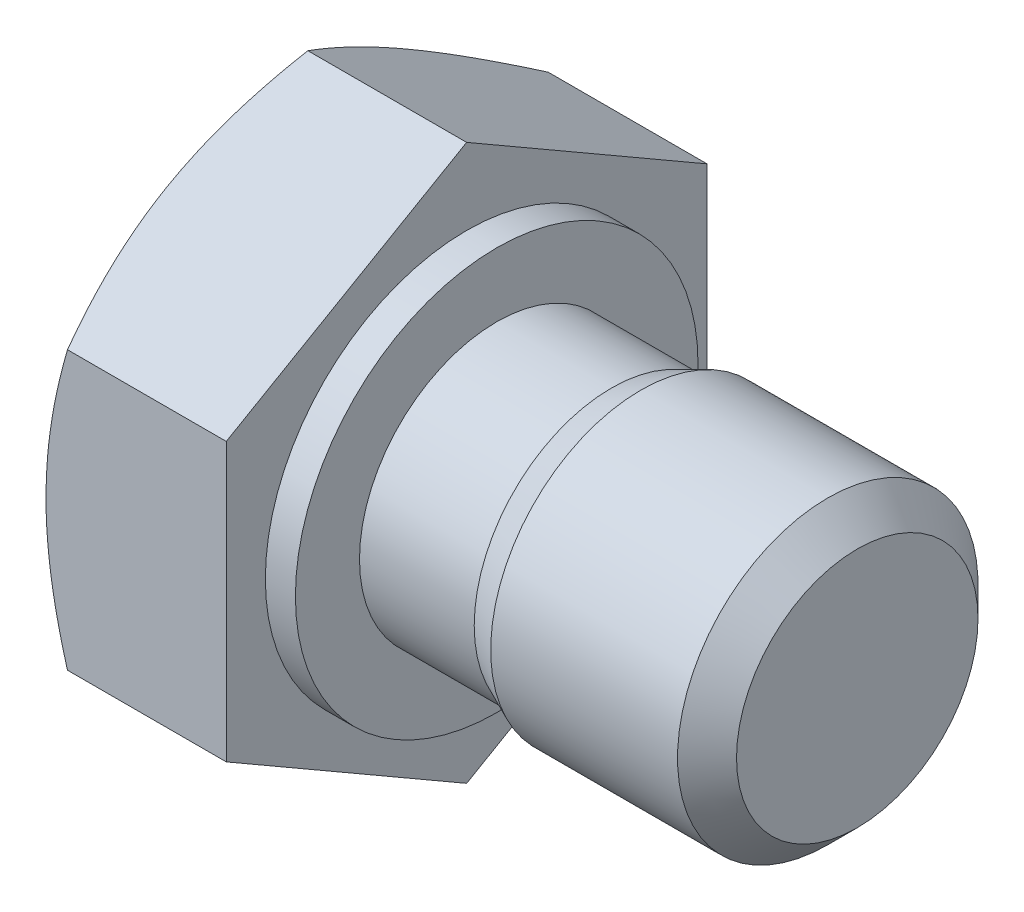
ISO-10303-21;
HEADER;
FILE_DESCRIPTION(('STEP AP214'),'2;1');
FILE_NAME('part.step','',(''),(''),'','','');
FILE_SCHEMA(('AUTOMOTIVE_DESIGN { 1 0 10303 214 1 1 1 1 }'));
ENDSEC;
DATA;
#1=APPLICATION_CONTEXT('core data for automotive mechanical design processes');
#2=APPLICATION_PROTOCOL_DEFINITION('international standard','automotive_design',2000,#1);
#3=PRODUCT_CONTEXT('',#1,'mechanical');
#4=PRODUCT('Part','Part','',(#3));
#5=PRODUCT_RELATED_PRODUCT_CATEGORY('part','',(#4));
#6=PRODUCT_DEFINITION_FORMATION('','',#4);
#7=PRODUCT_DEFINITION_CONTEXT('part definition',#1,'design');
#8=PRODUCT_DEFINITION('design','',#6,#7);
#9=PRODUCT_DEFINITION_SHAPE('','',#8);
#10=(LENGTH_UNIT() NAMED_UNIT(*) SI_UNIT(.MILLI.,.METRE.));
#11=(NAMED_UNIT(*) PLANE_ANGLE_UNIT() SI_UNIT($,.RADIAN.));
#12=(NAMED_UNIT(*) SI_UNIT($,.STERADIAN.) SOLID_ANGLE_UNIT());
#13=UNCERTAINTY_MEASURE_WITH_UNIT(LENGTH_MEASURE(1.E-05),#10,'distance_accuracy_value','');
#14=(GEOMETRIC_REPRESENTATION_CONTEXT(3) GLOBAL_UNCERTAINTY_ASSIGNED_CONTEXT((#13)) GLOBAL_UNIT_ASSIGNED_CONTEXT((#10,
#11,#12)) REPRESENTATION_CONTEXT('',''));
#15=CARTESIAN_POINT('',(0.,0.,0.));
#16=DIRECTION('',(0.,0.,1.));
#17=DIRECTION('',(1.,0.,0.));
#18=AXIS2_PLACEMENT_3D('',#15,#16,#17);
#19=CARTESIAN_POINT('',(2.15457,0.,0.));
#20=DIRECTION('',(1.,0.,0.));
#21=DIRECTION('',(0.,1.,0.));
#22=AXIS2_PLACEMENT_3D('',#19,#20,#21);
#23=CONICAL_SURFACE('',#22,2.3917468,0.415407709431619);
#24=CARTESIAN_POINT('',(2.4,0.,0.));
#25=DIRECTION('',(1.,0.,0.));
#26=DIRECTION('',(0.,1.,0.));
#27=AXIS2_PLACEMENT_3D('',#24,#25,#26);
#28=CIRCLE('',#27,2.5);
#29=CARTESIAN_POINT('',(2.4,-2.5,0.));
#30=VERTEX_POINT('',#29);
#31=EDGE_CURVE('E227',#30,#30,#28,.T.);
#32=ORIENTED_EDGE('',*,*,#31,.F.);
#33=DIRECTION('',(-0.914951860103324,0.403562998419662,0.));
#34=VECTOR('',#33,1.);
#35=CARTESIAN_POINT('',(2.15457,-2.3917468,0.));
#36=LINE('',#35,#34);
#37=CARTESIAN_POINT('',(1.90914,-2.2834936,0.));
#38=VERTEX_POINT('',#37);
#39=EDGE_CURVE('E11',#30,#38,#36,.T.);
#40=ORIENTED_EDGE('',*,*,#39,.T.);
#41=CARTESIAN_POINT('',(1.90914,0.,0.));
#42=DIRECTION('',(1.,0.,0.));
#43=DIRECTION('',(0.,1.,0.));
#44=AXIS2_PLACEMENT_3D('',#41,#42,#43);
#45=CIRCLE('',#44,2.2834936);
#46=EDGE_CURVE('E189',#38,#38,#45,.T.);
#47=ORIENTED_EDGE('',*,*,#46,.T.);
#48=ORIENTED_EDGE('',*,*,#39,.F.);
#49=EDGE_LOOP('',(#32,#40,#47,#48));
#50=FACE_BOUND('',#49,.T.);
#51=ADVANCED_FACE('F17',(#50),#23,.T.);
#52=CARTESIAN_POINT('',(0.95457,0.,0.));
#53=DIRECTION('',(1.,0.,0.));
#54=DIRECTION('',(0.,1.,0.));
#55=AXIS2_PLACEMENT_3D('',#52,#53,#54);
#56=CYLINDRICAL_SURFACE('',#55,2.2834936);
#57=ORIENTED_EDGE('',*,*,#46,.F.);
#58=DIRECTION('',(-1.,0.,0.));
#59=VECTOR('',#58,1.);
#60=CARTESIAN_POINT('',(0.95457,-2.2834936,0.));
#61=LINE('',#60,#59);
#62=CARTESIAN_POINT('',(0.,-2.2834936,0.));
#63=VERTEX_POINT('',#62);
#64=EDGE_CURVE('E28',#38,#63,#61,.T.);
#65=ORIENTED_EDGE('',*,*,#64,.T.);
#66=CARTESIAN_POINT('',(0.,0.,0.));
#67=DIRECTION('',(1.,0.,0.));
#68=DIRECTION('',(0.,1.,0.));
#69=AXIS2_PLACEMENT_3D('',#66,#67,#68);
#70=CIRCLE('',#69,2.2834936);
#71=EDGE_CURVE('E191',#63,#63,#70,.T.);
#72=ORIENTED_EDGE('',*,*,#71,.T.);
#73=ORIENTED_EDGE('',*,*,#64,.F.);
#74=EDGE_LOOP('',(#57,#65,#72,#73));
#75=FACE_BOUND('',#74,.T.);
#76=ADVANCED_FACE('F543',(#75),#56,.T.);
#77=CARTESIAN_POINT('',(0.,2.8167468,0.));
#78=DIRECTION('',(1.,0.,0.));
#79=DIRECTION('',(0.,1.,0.));
#80=AXIS2_PLACEMENT_3D('',#77,#78,#79);
#81=PLANE('',#80);
#82=ORIENTED_EDGE('',*,*,#71,.F.);
#83=EDGE_LOOP('',(#82));
#84=FACE_BOUND('',#83,.T.);
#85=CARTESIAN_POINT('',(0.,0.,0.));
#86=DIRECTION('',(1.,0.,0.));
#87=DIRECTION('',(0.,1.,0.));
#88=AXIS2_PLACEMENT_3D('',#85,#86,#87);
#89=CIRCLE('',#88,3.35);
#90=CARTESIAN_POINT('',(0.,-3.35,0.));
#91=VERTEX_POINT('',#90);
#92=EDGE_CURVE('E206',#91,#91,#89,.T.);
#93=ORIENTED_EDGE('',*,*,#92,.T.);
#94=EDGE_LOOP('',(#93));
#95=FACE_BOUND('',#94,.T.);
#96=ADVANCED_FACE('F549',(#84,#95),#81,.T.);
#97=CARTESIAN_POINT('',(-0.250049999999993,0.,0.));
#98=DIRECTION('',(1.,0.,0.));
#99=DIRECTION('',(0.,1.,0.));
#100=AXIS2_PLACEMENT_3D('',#97,#98,#99);
#101=CYLINDRICAL_SURFACE('',#100,3.35);
#102=ORIENTED_EDGE('',*,*,#92,.F.);
#103=DIRECTION('',(-1.,0.,0.));
#104=VECTOR('',#103,1.);
#105=CARTESIAN_POINT('',(-0.250049999999993,-3.35,0.));
#106=LINE('',#105,#104);
#107=CARTESIAN_POINT('',(-0.500099999999994,-3.35,0.));
#108=VERTEX_POINT('',#107);
#109=EDGE_CURVE('E199',#91,#108,#106,.T.);
#110=ORIENTED_EDGE('',*,*,#109,.T.);
#111=CARTESIAN_POINT('',(-0.500099999999993,0.,0.));
#112=DIRECTION('',(1.,0.,0.));
#113=DIRECTION('',(0.,1.,0.));
#114=AXIS2_PLACEMENT_3D('',#111,#112,#113);
#115=CIRCLE('',#114,3.35);
#116=EDGE_CURVE('E230',#108,#108,#115,.T.);
#117=ORIENTED_EDGE('',*,*,#116,.T.);
#118=ORIENTED_EDGE('',*,*,#109,.F.);
#119=EDGE_LOOP('',(#102,#110,#117,#118));
#120=FACE_BOUND('',#119,.T.);
#121=ADVANCED_FACE('F626',(#120),#101,.T.);
#122=CARTESIAN_POINT('',(-3.5001,0.,0.));
#123=DIRECTION('',(1.,0.,0.));
#124=DIRECTION('',(0.,1.,0.));
#125=AXIS2_PLACEMENT_3D('',#122,#123,#124);
#126=PLANE('',#125);
#127=CARTESIAN_POINT('',(-3.5001,0.,0.));
#128=DIRECTION('',(-1.,0.,0.));
#129=DIRECTION('',(0.,1.,0.));
#130=AXIS2_PLACEMENT_3D('',#127,#128,#129);
#131=CIRCLE('',#130,4.);
#132=CARTESIAN_POINT('',(-3.5001,0.,4.));
#133=VERTEX_POINT('',#132);
#134=CARTESIAN_POINT('',(-3.5001,3.46410161513775,2.));
#135=VERTEX_POINT('',#134);
#136=EDGE_CURVE('E210',#133,#135,#131,.T.);
#137=ORIENTED_EDGE('',*,*,#136,.T.);
#138=CARTESIAN_POINT('',(-3.5001,0.,0.));
#139=DIRECTION('',(-1.,0.,0.));
#140=DIRECTION('',(0.,1.,0.));
#141=AXIS2_PLACEMENT_3D('',#138,#139,#140);
#142=CIRCLE('',#141,4.);
#143=CARTESIAN_POINT('',(-3.5001,3.46410161513775,-2.));
#144=VERTEX_POINT('',#143);
#145=EDGE_CURVE('E159',#135,#144,#142,.T.);
#146=ORIENTED_EDGE('',*,*,#145,.T.);
#147=CARTESIAN_POINT('',(-3.5001,0.,0.));
#148=DIRECTION('',(-1.,0.,0.));
#149=DIRECTION('',(0.,1.,0.));
#150=AXIS2_PLACEMENT_3D('',#147,#148,#149);
#151=CIRCLE('',#150,4.);
#152=CARTESIAN_POINT('',(-3.5001,0.,-4.));
#153=VERTEX_POINT('',#152);
#154=EDGE_CURVE('E155',#144,#153,#151,.T.);
#155=ORIENTED_EDGE('',*,*,#154,.T.);
#156=CARTESIAN_POINT('',(-3.5001,0.,0.));
#157=DIRECTION('',(-1.,0.,0.));
#158=DIRECTION('',(0.,1.,0.));
#159=AXIS2_PLACEMENT_3D('',#156,#157,#158);
#160=CIRCLE('',#159,4.);
#161=CARTESIAN_POINT('',(-3.5001,-3.46410161513775,-2.));
#162=VERTEX_POINT('',#161);
#163=EDGE_CURVE('E129',#153,#162,#160,.T.);
#164=ORIENTED_EDGE('',*,*,#163,.T.);
#165=CARTESIAN_POINT('',(-3.5001,0.,0.));
#166=DIRECTION('',(-1.,0.,0.));
#167=DIRECTION('',(0.,1.,0.));
#168=AXIS2_PLACEMENT_3D('',#165,#166,#167);
#169=CIRCLE('',#168,4.);
#170=CARTESIAN_POINT('',(-3.5001,-3.46410161513775,2.));
#171=VERTEX_POINT('',#170);
#172=EDGE_CURVE('E167',#162,#171,#169,.T.);
#173=ORIENTED_EDGE('',*,*,#172,.T.);
#174=CARTESIAN_POINT('',(-3.5001,0.,0.));
#175=DIRECTION('',(-1.,0.,0.));
#176=DIRECTION('',(0.,1.,0.));
#177=AXIS2_PLACEMENT_3D('',#174,#175,#176);
#178=CIRCLE('',#177,4.);
#179=EDGE_CURVE('E218',#171,#133,#178,.T.);
#180=ORIENTED_EDGE('',*,*,#179,.T.);
#181=EDGE_LOOP('',(#137,#146,#155,#164,#173,#180));
#182=FACE_BOUND('',#181,.T.);
#183=ADVANCED_FACE('F157',(#182),#126,.F.);
#184=CARTESIAN_POINT('',(-0.500099999999993,-4.618802153517,0.));
#185=DIRECTION('',(0.,-0.866025403784439,-0.5));
#186=DIRECTION('',(0.,0.5,-0.866025403784439));
#187=AXIS2_PLACEMENT_3D('',#184,#185,#186);
#188=PLANE('',#187);
#189=CARTESIAN_POINT('',(-3.5001,-3.46410161513775,-2.));
#190=CARTESIAN_POINT('',(-3.50010000000001,-2.92820323027551,-2.9282032302755));
#191=CARTESIAN_POINT('',(-3.14283441009186,-2.30940107675851,-4.));
#192=(BOUNDED_CURVE() B_SPLINE_CURVE(2,(#189,#190,#191),.UNSPECIFIED.,.F.,
.F.) B_SPLINE_CURVE_WITH_KNOTS((3,3),(0.234283887510094,0.468567775020188),
.UNSPECIFIED.) CURVE() GEOMETRIC_REPRESENTATION_ITEM() RATIONAL_B_SPLINE_CURVE((1.,
1.03795484930204,1.)) REPRESENTATION_ITEM(''));
#193=CARTESIAN_POINT('',(-3.14283441009186,-2.30940107675851,-4.));
#194=VERTEX_POINT('',#193);
#195=EDGE_CURVE('E134',#162,#194,#192,.T.);
#196=ORIENTED_EDGE('',*,*,#195,.T.);
#197=DIRECTION('',(-1.,0.,0.));
#198=VECTOR('',#197,1.);
#199=CARTESIAN_POINT('',(-0.500099999999993,-2.3094010767585,-4.));
#200=LINE('',#199,#198);
#201=CARTESIAN_POINT('',(-0.500099999999993,-2.3094010767585,-4.));
#202=VERTEX_POINT('',#201);
#203=EDGE_CURVE('E21',#202,#194,#200,.T.);
#204=ORIENTED_EDGE('',*,*,#203,.F.);
#205=DIRECTION('',(0.,0.5,-0.866025403784439));
#206=VECTOR('',#205,1.);
#207=CARTESIAN_POINT('',(-0.500099999999993,-4.618802153517,0.));
#208=LINE('',#207,#206);
#209=CARTESIAN_POINT('',(-0.500099999999993,-4.618802153517,0.));
#210=VERTEX_POINT('',#209);
#211=EDGE_CURVE('E187',#210,#202,#208,.T.);
#212=ORIENTED_EDGE('',*,*,#211,.F.);
#213=DIRECTION('',(-1.,0.,0.));
#214=VECTOR('',#213,1.);
#215=CARTESIAN_POINT('',(-0.500099999999993,-4.618802153517,0.));
#216=LINE('',#215,#214);
#217=CARTESIAN_POINT('',(-3.14283441009186,-4.61880215351699,0.));
#218=VERTEX_POINT('',#217);
#219=EDGE_CURVE('E237',#210,#218,#216,.T.);
#220=ORIENTED_EDGE('',*,*,#219,.T.);
#221=CARTESIAN_POINT('',(-3.14283441009186,-4.61880215351699,0.));
#222=CARTESIAN_POINT('',(-3.50010000000001,-3.99999999999999,-1.07179676972451));
#223=CARTESIAN_POINT('',(-3.5001,-3.46410161513775,-2.));
#224=(BOUNDED_CURVE() B_SPLINE_CURVE(2,(#221,#222,#223),.UNSPECIFIED.,.F.,
.F.) B_SPLINE_CURVE_WITH_KNOTS((3,3),(0.,0.234283887510094),
.UNSPECIFIED.) CURVE() GEOMETRIC_REPRESENTATION_ITEM() RATIONAL_B_SPLINE_CURVE((1.,
1.03795484930204,1.)) REPRESENTATION_ITEM(''));
#225=EDGE_CURVE('E301',#218,#162,#224,.T.);
#226=ORIENTED_EDGE('',*,*,#225,.T.);
#227=EDGE_LOOP('',(#196,#204,#212,#220,#226));
#228=FACE_BOUND('',#227,.T.);
#229=ADVANCED_FACE('F520',(#228),#188,.T.);
#230=CARTESIAN_POINT('',(-0.500099999999993,-2.3094010767585,4.));
#231=DIRECTION('',(0.,-0.866025403784439,0.5));
#232=DIRECTION('',(-1.,0.,0.));
#233=AXIS2_PLACEMENT_3D('',#230,#231,#232);
#234=PLANE('',#233);
#235=CARTESIAN_POINT('',(-3.5001,-3.46410161513775,2.));
#236=CARTESIAN_POINT('',(-3.50010000000001,-3.99999999999999,1.0717967697245));
#237=CARTESIAN_POINT('',(-3.14283441009186,-4.61880215351699,0.));
#238=(BOUNDED_CURVE() B_SPLINE_CURVE(2,(#235,#236,#237),.UNSPECIFIED.,.F.,
.F.) B_SPLINE_CURVE_WITH_KNOTS((3,3),(0.234283887510094,0.468567775020188),
.UNSPECIFIED.) CURVE() GEOMETRIC_REPRESENTATION_ITEM() RATIONAL_B_SPLINE_CURVE((1.,
1.03795484930205,1.)) REPRESENTATION_ITEM(''));
#239=EDGE_CURVE('E173',#171,#218,#238,.T.);
#240=ORIENTED_EDGE('',*,*,#239,.T.);
#241=ORIENTED_EDGE('',*,*,#219,.F.);
#242=DIRECTION('',(0.,-0.5,-0.866025403784439));
#243=VECTOR('',#242,1.);
#244=CARTESIAN_POINT('',(-0.500099999999993,-2.3094010767585,4.));
#245=LINE('',#244,#243);
#246=CARTESIAN_POINT('',(-0.500099999999993,-2.3094010767585,4.));
#247=VERTEX_POINT('',#246);
#248=EDGE_CURVE('E180',#247,#210,#245,.T.);
#249=ORIENTED_EDGE('',*,*,#248,.F.);
#250=DIRECTION('',(-1.,0.,0.));
#251=VECTOR('',#250,1.);
#252=CARTESIAN_POINT('',(-0.500099999999993,-2.3094010767585,4.));
#253=LINE('',#252,#251);
#254=CARTESIAN_POINT('',(-3.14283441009186,-2.30940107675848,4.));
#255=VERTEX_POINT('',#254);
#256=EDGE_CURVE('E235',#247,#255,#253,.T.);
#257=ORIENTED_EDGE('',*,*,#256,.T.);
#258=CARTESIAN_POINT('',(-3.14283441009186,-2.30940107675852,4.));
#259=CARTESIAN_POINT('',(-3.50010000000001,-2.92820323027551,2.9282032302755));
#260=CARTESIAN_POINT('',(-3.5001,-3.46410161513775,2.));
#261=(BOUNDED_CURVE() B_SPLINE_CURVE(2,(#258,#259,#260),.UNSPECIFIED.,.F.,
.F.) B_SPLINE_CURVE_WITH_KNOTS((3,3),(0.,0.234283887510094),
.UNSPECIFIED.) CURVE() GEOMETRIC_REPRESENTATION_ITEM() RATIONAL_B_SPLINE_CURVE((1.,
1.03795484930203,1.)) REPRESENTATION_ITEM(''));
#262=EDGE_CURVE('E219',#255,#171,#261,.T.);
#263=ORIENTED_EDGE('',*,*,#262,.T.);
#264=EDGE_LOOP('',(#240,#241,#249,#257,#263));
#265=FACE_BOUND('',#264,.T.);
#266=ADVANCED_FACE('F528',(#265),#234,.T.);
#267=CARTESIAN_POINT('',(-0.500099999999994,2.3094010767585,4.));
#268=DIRECTION('',(0.,0.,1.));
#269=DIRECTION('',(0.,-1.,0.));
#270=AXIS2_PLACEMENT_3D('',#267,#268,#269);
#271=PLANE('',#270);
#272=CARTESIAN_POINT('',(-3.5001,0.,4.));
#273=CARTESIAN_POINT('',(-3.50010000000001,-1.07179676972448,4.));
#274=CARTESIAN_POINT('',(-3.14283441009186,-2.30940107675848,4.));
#275=(BOUNDED_CURVE() B_SPLINE_CURVE(2,(#272,#273,#274),.UNSPECIFIED.,.F.,
.F.) B_SPLINE_CURVE_WITH_KNOTS((3,3),(0.234283887510094,0.468567775020188),
.UNSPECIFIED.) CURVE() GEOMETRIC_REPRESENTATION_ITEM() RATIONAL_B_SPLINE_CURVE((1.,
1.03795484930205,1.)) REPRESENTATION_ITEM(''));
#276=EDGE_CURVE('E212',#133,#255,#275,.T.);
#277=ORIENTED_EDGE('',*,*,#276,.T.);
#278=ORIENTED_EDGE('',*,*,#256,.F.);
#279=DIRECTION('',(0.,-1.,0.));
#280=VECTOR('',#279,1.);
#281=CARTESIAN_POINT('',(-0.500099999999994,2.3094010767585,4.));
#282=LINE('',#281,#280);
#283=CARTESIAN_POINT('',(-0.500099999999994,2.3094010767585,4.));
#284=VERTEX_POINT('',#283);
#285=EDGE_CURVE('E188',#284,#247,#282,.T.);
#286=ORIENTED_EDGE('',*,*,#285,.F.);
#287=DIRECTION('',(-1.,0.,0.));
#288=VECTOR('',#287,1.);
#289=CARTESIAN_POINT('',(-0.500099999999994,2.3094010767585,4.));
#290=LINE('',#289,#288);
#291=CARTESIAN_POINT('',(-3.14283441009186,2.30940107675847,4.));
#292=VERTEX_POINT('',#291);
#293=EDGE_CURVE('E254',#284,#292,#290,.T.);
#294=ORIENTED_EDGE('',*,*,#293,.T.);
#295=CARTESIAN_POINT('',(-3.14283441009186,2.30940107675847,4.));
#296=CARTESIAN_POINT('',(-3.50010000000001,1.07179676972448,4.));
#297=CARTESIAN_POINT('',(-3.5001,0.,4.));
#298=(BOUNDED_CURVE() B_SPLINE_CURVE(2,(#295,#296,#297),.UNSPECIFIED.,.F.,
.F.) B_SPLINE_CURVE_WITH_KNOTS((3,3),(0.,0.234283887510094),
.UNSPECIFIED.) CURVE() GEOMETRIC_REPRESENTATION_ITEM() RATIONAL_B_SPLINE_CURVE((1.,
1.03795484930205,1.)) REPRESENTATION_ITEM(''));
#299=EDGE_CURVE('E262',#292,#133,#298,.T.);
#300=ORIENTED_EDGE('',*,*,#299,.T.);
#301=EDGE_LOOP('',(#277,#278,#286,#294,#300));
#302=FACE_BOUND('',#301,.T.);
#303=ADVANCED_FACE('F367',(#302),#271,.T.);
#304=CARTESIAN_POINT('',(-0.500099999999993,0.,0.));
#305=DIRECTION('',(1.,0.,0.));
#306=DIRECTION('',(0.,1.,0.));
#307=AXIS2_PLACEMENT_3D('',#304,#305,#306);
#308=PLANE('',#307);
#309=ORIENTED_EDGE('',*,*,#116,.F.);
#310=EDGE_LOOP('',(#309));
#311=FACE_BOUND('',#310,.T.);
#312=DIRECTION('',(0.,-0.5,0.866025403784438));
#313=VECTOR('',#312,1.);
#314=CARTESIAN_POINT('',(-0.500099999999994,4.618802153517,0.));
#315=LINE('',#314,#313);
#316=CARTESIAN_POINT('',(-0.500099999999994,4.618802153517,0.));
#317=VERTEX_POINT('',#316);
#318=EDGE_CURVE('E281',#317,#284,#315,.T.);
#319=ORIENTED_EDGE('',*,*,#318,.T.);
#320=ORIENTED_EDGE('',*,*,#285,.T.);
#321=ORIENTED_EDGE('',*,*,#248,.T.);
#322=ORIENTED_EDGE('',*,*,#211,.T.);
#323=DIRECTION('',(0.,1.,0.));
#324=VECTOR('',#323,1.);
#325=CARTESIAN_POINT('',(-0.500099999999993,-2.3094010767585,-4.));
#326=LINE('',#325,#324);
#327=CARTESIAN_POINT('',(-0.500099999999994,2.3094010767585,-4.));
#328=VERTEX_POINT('',#327);
#329=EDGE_CURVE('E280',#202,#328,#326,.T.);
#330=ORIENTED_EDGE('',*,*,#329,.T.);
#331=DIRECTION('',(0.,0.5,0.866025403784439));
#332=VECTOR('',#331,1.);
#333=CARTESIAN_POINT('',(-0.500099999999994,2.3094010767585,-4.));
#334=LINE('',#333,#332);
#335=EDGE_CURVE('E356',#328,#317,#334,.T.);
#336=ORIENTED_EDGE('',*,*,#335,.T.);
#337=EDGE_LOOP('',(#319,#320,#321,#322,#330,#336));
#338=FACE_BOUND('',#337,.T.);
#339=ADVANCED_FACE('F537',(#311,#338),#308,.T.);
#340=CARTESIAN_POINT('',(-0.500099999999994,4.618802153517,0.));
#341=DIRECTION('',(0.,0.866025403784438,0.5));
#342=DIRECTION('',(1.,0.,0.));
#343=AXIS2_PLACEMENT_3D('',#340,#341,#342);
#344=PLANE('',#343);
#345=CARTESIAN_POINT('',(-3.14283441009186,4.61880215351699,0.));
#346=CARTESIAN_POINT('',(-3.50010000000001,3.99999999999999,1.0717967697245));
#347=CARTESIAN_POINT('',(-3.5001,3.46410161513775,2.));
#348=(BOUNDED_CURVE() B_SPLINE_CURVE(2,(#345,#346,#347),.UNSPECIFIED.,.F.,
.F.) B_SPLINE_CURVE_WITH_KNOTS((3,3),(0.,0.234283887510094),
.UNSPECIFIED.) CURVE() GEOMETRIC_REPRESENTATION_ITEM() RATIONAL_B_SPLINE_CURVE((1.,
1.03795484930203,1.)) REPRESENTATION_ITEM(''));
#349=CARTESIAN_POINT('',(-3.14283441009186,4.61880215351699,0.));
#350=VERTEX_POINT('',#349);
#351=EDGE_CURVE('E296',#350,#135,#348,.T.);
#352=ORIENTED_EDGE('',*,*,#351,.T.);
#353=CARTESIAN_POINT('',(-3.5001,3.46410161513775,2.));
#354=CARTESIAN_POINT('',(-3.50010000000001,2.92820323027551,2.9282032302755));
#355=CARTESIAN_POINT('',(-3.14283441009186,2.30940107675851,4.));
#356=(BOUNDED_CURVE() B_SPLINE_CURVE(2,(#353,#354,#355),.UNSPECIFIED.,.F.,
.F.) B_SPLINE_CURVE_WITH_KNOTS((3,3),(0.234283887510094,0.468567775020188),
.UNSPECIFIED.) CURVE() GEOMETRIC_REPRESENTATION_ITEM() RATIONAL_B_SPLINE_CURVE((1.,
1.03795484930203,1.)) REPRESENTATION_ITEM(''));
#357=EDGE_CURVE('E270',#135,#292,#356,.T.);
#358=ORIENTED_EDGE('',*,*,#357,.T.);
#359=ORIENTED_EDGE('',*,*,#293,.F.);
#360=ORIENTED_EDGE('',*,*,#318,.F.);
#361=DIRECTION('',(-1.,0.,0.));
#362=VECTOR('',#361,1.);
#363=CARTESIAN_POINT('',(-0.500099999999994,4.618802153517,0.));
#364=LINE('',#363,#362);
#365=EDGE_CURVE('E354',#317,#350,#364,.T.);
#366=ORIENTED_EDGE('',*,*,#365,.T.);
#367=EDGE_LOOP('',(#352,#358,#359,#360,#366));
#368=FACE_BOUND('',#367,.T.);
#369=ADVANCED_FACE('F19',(#368),#344,.T.);
#370=CARTESIAN_POINT('',(-0.500099999999994,2.3094010767585,-4.));
#371=DIRECTION('',(0.,0.866025403784439,-0.5));
#372=DIRECTION('',(-1.,0.,0.));
#373=AXIS2_PLACEMENT_3D('',#370,#371,#372);
#374=PLANE('',#373);
#375=CARTESIAN_POINT('',(-3.14283441009186,2.30940107675851,-4.));
#376=CARTESIAN_POINT('',(-3.50010000000001,2.92820323027551,-2.92820323027549));
#377=CARTESIAN_POINT('',(-3.5001,3.46410161513775,-2.));
#378=(BOUNDED_CURVE() B_SPLINE_CURVE(2,(#375,#376,#377),.UNSPECIFIED.,.F.,
.F.) B_SPLINE_CURVE_WITH_KNOTS((3,3),(0.,0.234283887510095),
.UNSPECIFIED.) CURVE() GEOMETRIC_REPRESENTATION_ITEM() RATIONAL_B_SPLINE_CURVE((1.,
1.03795484930206,1.)) REPRESENTATION_ITEM(''));
#379=CARTESIAN_POINT('',(-3.14283441009186,2.30940107675848,-4.));
#380=VERTEX_POINT('',#379);
#381=EDGE_CURVE('E151',#380,#144,#378,.T.);
#382=ORIENTED_EDGE('',*,*,#381,.T.);
#383=CARTESIAN_POINT('',(-3.5001,3.46410161513775,-2.));
#384=CARTESIAN_POINT('',(-3.50010000000001,3.99999999999999,-1.0717967697245));
#385=CARTESIAN_POINT('',(-3.14283441009186,4.61880215351699,0.));
#386=(BOUNDED_CURVE() B_SPLINE_CURVE(2,(#383,#384,#385),.UNSPECIFIED.,.F.,
.F.) B_SPLINE_CURVE_WITH_KNOTS((3,3),(0.234283887510095,0.468567775020189),
.UNSPECIFIED.) CURVE() GEOMETRIC_REPRESENTATION_ITEM() RATIONAL_B_SPLINE_CURVE((1.,
1.03795484930204,1.)) REPRESENTATION_ITEM(''));
#387=EDGE_CURVE('E295',#144,#350,#386,.T.);
#388=ORIENTED_EDGE('',*,*,#387,.T.);
#389=ORIENTED_EDGE('',*,*,#365,.F.);
#390=ORIENTED_EDGE('',*,*,#335,.F.);
#391=DIRECTION('',(-1.,0.,0.));
#392=VECTOR('',#391,1.);
#393=CARTESIAN_POINT('',(-0.500099999999994,2.3094010767585,-4.));
#394=LINE('',#393,#392);
#395=EDGE_CURVE('E139',#328,#380,#394,.T.);
#396=ORIENTED_EDGE('',*,*,#395,.T.);
#397=EDGE_LOOP('',(#382,#388,#389,#390,#396));
#398=FACE_BOUND('',#397,.T.);
#399=ADVANCED_FACE('F558',(#398),#374,.T.);
#400=CARTESIAN_POINT('',(-0.500099999999993,-2.3094010767585,-4.));
#401=DIRECTION('',(0.,0.,-1.));
#402=DIRECTION('',(-1.,0.,0.));
#403=AXIS2_PLACEMENT_3D('',#400,#401,#402);
#404=PLANE('',#403);
#405=CARTESIAN_POINT('',(-3.14283441009186,-2.30940107675847,-4.));
#406=CARTESIAN_POINT('',(-3.50010000000001,-1.07179676972448,-4.));
#407=CARTESIAN_POINT('',(-3.5001,0.,-4.));
#408=(BOUNDED_CURVE() B_SPLINE_CURVE(2,(#405,#406,#407),.UNSPECIFIED.,.F.,
.F.) B_SPLINE_CURVE_WITH_KNOTS((3,3),(0.,0.234283887510094),
.UNSPECIFIED.) CURVE() GEOMETRIC_REPRESENTATION_ITEM() RATIONAL_B_SPLINE_CURVE((1.,
1.03795484930204,1.)) REPRESENTATION_ITEM(''));
#409=EDGE_CURVE('E132',#194,#153,#408,.T.);
#410=ORIENTED_EDGE('',*,*,#409,.T.);
#411=CARTESIAN_POINT('',(-3.5001,0.,-4.));
#412=CARTESIAN_POINT('',(-3.50010000000001,1.07179676972448,-4.));
#413=CARTESIAN_POINT('',(-3.14283441009186,2.30940107675848,-4.));
#414=(BOUNDED_CURVE() B_SPLINE_CURVE(2,(#411,#412,#413),.UNSPECIFIED.,.F.,
.F.) B_SPLINE_CURVE_WITH_KNOTS((3,3),(0.234283887510094,0.468567775020189),
.UNSPECIFIED.) CURVE() GEOMETRIC_REPRESENTATION_ITEM() RATIONAL_B_SPLINE_CURVE((1.,
1.03795484930204,1.)) REPRESENTATION_ITEM(''));
#415=EDGE_CURVE('E147',#153,#380,#414,.T.);
#416=ORIENTED_EDGE('',*,*,#415,.T.);
#417=ORIENTED_EDGE('',*,*,#395,.F.);
#418=ORIENTED_EDGE('',*,*,#329,.F.);
#419=ORIENTED_EDGE('',*,*,#203,.T.);
#420=EDGE_LOOP('',(#410,#416,#417,#418,#419));
#421=FACE_BOUND('',#420,.T.);
#422=ADVANCED_FACE('F144',(#421),#404,.T.);
#423=CARTESIAN_POINT('',(-3.32146720504593,0.,0.));
#424=DIRECTION('',(1.,0.,0.));
#425=DIRECTION('',(0.,1.,0.));
#426=AXIS2_PLACEMENT_3D('',#423,#424,#425);
#427=CONICAL_SURFACE('',#426,4.30940107675849,1.0471975511966);
#428=ORIENTED_EDGE('',*,*,#409,.F.);
#429=ORIENTED_EDGE('',*,*,#195,.F.);
#430=ORIENTED_EDGE('',*,*,#163,.F.);
#431=EDGE_LOOP('',(#428,#429,#430));
#432=FACE_BOUND('',#431,.T.);
#433=ADVANCED_FACE('F131',(#432),#427,.T.);
#434=CARTESIAN_POINT('',(-3.32146720504593,0.,0.));
#435=DIRECTION('',(1.,0.,0.));
#436=DIRECTION('',(0.,1.,0.));
#437=AXIS2_PLACEMENT_3D('',#434,#435,#436);
#438=CONICAL_SURFACE('',#437,4.30940107675849,1.0471975511966);
#439=ORIENTED_EDGE('',*,*,#415,.F.);
#440=ORIENTED_EDGE('',*,*,#154,.F.);
#441=ORIENTED_EDGE('',*,*,#381,.F.);
#442=EDGE_LOOP('',(#439,#440,#441));
#443=FACE_BOUND('',#442,.T.);
#444=ADVANCED_FACE('F165',(#443),#438,.T.);
#445=CARTESIAN_POINT('',(-3.32146720504593,0.,0.));
#446=DIRECTION('',(1.,0.,0.));
#447=DIRECTION('',(0.,-1.,0.));
#448=AXIS2_PLACEMENT_3D('',#445,#446,#447);
#449=CONICAL_SURFACE('',#448,4.30940107675849,1.0471975511966);
#450=ORIENTED_EDGE('',*,*,#225,.F.);
#451=ORIENTED_EDGE('',*,*,#239,.F.);
#452=ORIENTED_EDGE('',*,*,#172,.F.);
#453=EDGE_LOOP('',(#450,#451,#452));
#454=FACE_BOUND('',#453,.T.);
#455=ADVANCED_FACE('F524',(#454),#449,.T.);
#456=CARTESIAN_POINT('',(-3.32146720504593,0.,0.));
#457=DIRECTION('',(1.,0.,0.));
#458=DIRECTION('',(0.,1.,0.));
#459=AXIS2_PLACEMENT_3D('',#456,#457,#458);
#460=CONICAL_SURFACE('',#459,4.30940107675849,1.0471975511966);
#461=ORIENTED_EDGE('',*,*,#387,.F.);
#462=ORIENTED_EDGE('',*,*,#145,.F.);
#463=ORIENTED_EDGE('',*,*,#351,.F.);
#464=EDGE_LOOP('',(#461,#462,#463));
#465=FACE_BOUND('',#464,.T.);
#466=ADVANCED_FACE('F573',(#465),#460,.T.);
#467=CARTESIAN_POINT('',(-3.32146720504593,0.,0.));
#468=DIRECTION('',(1.,0.,0.));
#469=DIRECTION('',(0.,1.,0.));
#470=AXIS2_PLACEMENT_3D('',#467,#468,#469);
#471=CONICAL_SURFACE('',#470,4.30940107675849,1.0471975511966);
#472=ORIENTED_EDGE('',*,*,#262,.F.);
#473=ORIENTED_EDGE('',*,*,#276,.F.);
#474=ORIENTED_EDGE('',*,*,#179,.F.);
#475=EDGE_LOOP('',(#472,#473,#474));
#476=FACE_BOUND('',#475,.T.);
#477=ADVANCED_FACE('F527',(#476),#471,.T.);
#478=CARTESIAN_POINT('',(-3.32146720504593,0.,0.));
#479=DIRECTION('',(1.,0.,0.));
#480=DIRECTION('',(0.,1.,0.));
#481=AXIS2_PLACEMENT_3D('',#478,#479,#480);
#482=CONICAL_SURFACE('',#481,4.30940107675849,1.0471975511966);
#483=ORIENTED_EDGE('',*,*,#357,.F.);
#484=ORIENTED_EDGE('',*,*,#136,.F.);
#485=ORIENTED_EDGE('',*,*,#299,.F.);
#486=EDGE_LOOP('',(#483,#484,#485));
#487=FACE_BOUND('',#486,.T.);
#488=ADVANCED_FACE('F369',(#487),#482,.T.);
#489=CARTESIAN_POINT('',(6.,1.25,0.));
#490=DIRECTION('',(1.,0.,0.));
#491=DIRECTION('',(0.,1.,0.));
#492=AXIS2_PLACEMENT_3D('',#489,#490,#491);
#493=PLANE('',#492);
#494=CARTESIAN_POINT('',(6.,0.,0.));
#495=DIRECTION('',(-1.,0.,0.));
#496=DIRECTION('',(0.,-1.,0.));
#497=AXIS2_PLACEMENT_3D('',#494,#495,#496);
#498=CIRCLE('',#497,2.00924);
#499=CARTESIAN_POINT('',(6.,2.00924,0.));
#500=VERTEX_POINT('',#499);
#501=EDGE_CURVE('E232',#500,#500,#498,.T.);
#502=ORIENTED_EDGE('',*,*,#501,.F.);
#503=EDGE_LOOP('',(#502));
#504=FACE_BOUND('',#503,.T.);
#505=ADVANCED_FACE('F557',(#504),#493,.T.);
#506=CARTESIAN_POINT('',(4.2,0.,0.));
#507=DIRECTION('',(1.,0.,0.));
#508=DIRECTION('',(0.,1.,0.));
#509=AXIS2_PLACEMENT_3D('',#506,#507,#508);
#510=CYLINDRICAL_SURFACE('',#509,2.5);
#511=CARTESIAN_POINT('',(5.50914,0.,0.));
#512=DIRECTION('',(1.,0.,0.));
#513=DIRECTION('',(0.,-1.,0.));
#514=AXIS2_PLACEMENT_3D('',#511,#512,#513);
#515=CIRCLE('',#514,2.5);
#516=CARTESIAN_POINT('',(5.50914,2.5,0.));
#517=VERTEX_POINT('',#516);
#518=CARTESIAN_POINT('',(5.50914,-2.5,0.));
#519=VERTEX_POINT('',#518);
#520=EDGE_CURVE('E285',#517,#519,#515,.T.);
#521=ORIENTED_EDGE('',*,*,#520,.F.);
#522=CARTESIAN_POINT('',(5.50914,0.,0.));
#523=DIRECTION('',(1.,0.,0.));
#524=DIRECTION('',(0.,-1.,0.));
#525=AXIS2_PLACEMENT_3D('',#522,#523,#524);
#526=CIRCLE('',#525,2.5);
#527=EDGE_CURVE('E228',#519,#517,#526,.T.);
#528=ORIENTED_EDGE('',*,*,#527,.F.);
#529=DIRECTION('',(-1.,0.,0.));
#530=VECTOR('',#529,1.);
#531=CARTESIAN_POINT('',(4.2,-2.5,0.));
#532=LINE('',#531,#530);
#533=EDGE_CURVE('E220',#519,#30,#532,.T.);
#534=ORIENTED_EDGE('',*,*,#533,.T.);
#535=ORIENTED_EDGE('',*,*,#31,.T.);
#536=ORIENTED_EDGE('',*,*,#533,.F.);
#537=EDGE_LOOP('',(#521,#528,#534,#535,#536));
#538=FACE_BOUND('',#537,.T.);
#539=ADVANCED_FACE('F390',(#538),#510,.T.);
#540=CARTESIAN_POINT('',(5.75457,0.,0.));
#541=DIRECTION('',(-1.,0.,0.));
#542=DIRECTION('',(0.,-1.,0.));
#543=AXIS2_PLACEMENT_3D('',#540,#541,#542);
#544=CONICAL_SURFACE('',#543,2.25462,0.785296290982814);
#545=ORIENTED_EDGE('',*,*,#501,.T.);
#546=DIRECTION('',(-0.707178812192455,0.707034742842294,0.));
#547=VECTOR('',#546,1.);
#548=CARTESIAN_POINT('',(5.75457,2.25462,0.));
#549=LINE('',#548,#547);
#550=EDGE_CURVE('E178',#500,#517,#549,.T.);
#551=ORIENTED_EDGE('',*,*,#550,.T.);
#552=ORIENTED_EDGE('',*,*,#520,.T.);
#553=ORIENTED_EDGE('',*,*,#527,.T.);
#554=ORIENTED_EDGE('',*,*,#550,.F.);
#555=EDGE_LOOP('',(#545,#551,#552,#553,#554));
#556=FACE_BOUND('',#555,.T.);
#557=ADVANCED_FACE('F388',(#556),#544,.T.);
#558=CLOSED_SHELL('',(#51,#76,#96,#121,#183,#229,#266,#303,#339,#369,#399,#422,#433,#444,#455,
#466,#477,#488,#505,#539,#557));
#559=MANIFOLD_SOLID_BREP('B1',#558);
#560=ADVANCED_BREP_SHAPE_REPRESENTATION('',(#18,#559),#14);
#561=SHAPE_DEFINITION_REPRESENTATION(#9,#560);
ENDSEC;
END-ISO-10303-21;
